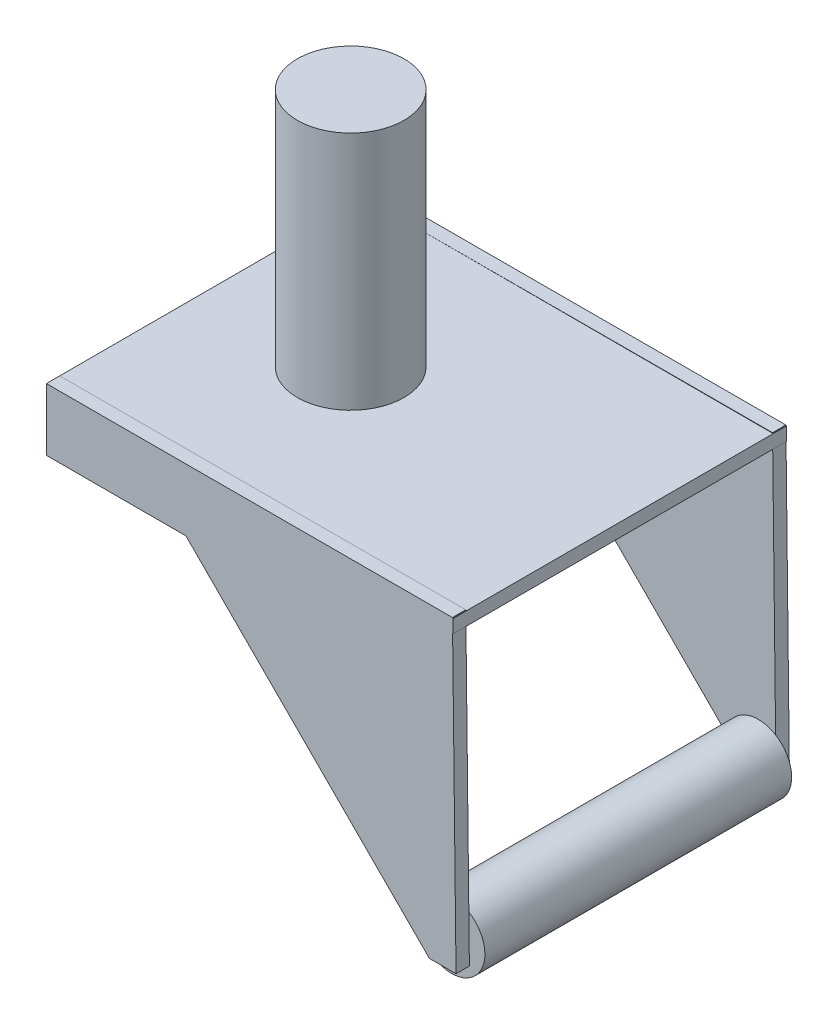
ISO-10303-21;
HEADER;
FILE_DESCRIPTION(('STEP AP214'),'2;1');
FILE_NAME('part.step','',(''),(''),'','','');
FILE_SCHEMA(('AUTOMOTIVE_DESIGN { 1 0 10303 214 1 1 1 1 }'));
ENDSEC;
DATA;
#1=APPLICATION_CONTEXT('core data for automotive mechanical design processes');
#2=APPLICATION_PROTOCOL_DEFINITION('international standard','automotive_design',2000,#1);
#3=PRODUCT_CONTEXT('',#1,'mechanical');
#4=PRODUCT('Part','Part','',(#3));
#5=PRODUCT_RELATED_PRODUCT_CATEGORY('part','',(#4));
#6=PRODUCT_DEFINITION_FORMATION('','',#4);
#7=PRODUCT_DEFINITION_CONTEXT('part definition',#1,'design');
#8=PRODUCT_DEFINITION('design','',#6,#7);
#9=PRODUCT_DEFINITION_SHAPE('','',#8);
#10=(LENGTH_UNIT() NAMED_UNIT(*) SI_UNIT(.MILLI.,.METRE.));
#11=(NAMED_UNIT(*) PLANE_ANGLE_UNIT() SI_UNIT($,.RADIAN.));
#12=(NAMED_UNIT(*) SI_UNIT($,.STERADIAN.) SOLID_ANGLE_UNIT());
#13=UNCERTAINTY_MEASURE_WITH_UNIT(LENGTH_MEASURE(1.E-05),#10,'distance_accuracy_value','');
#14=(GEOMETRIC_REPRESENTATION_CONTEXT(3) GLOBAL_UNCERTAINTY_ASSIGNED_CONTEXT((#13)) GLOBAL_UNIT_ASSIGNED_CONTEXT((#10,
#11,#12)) REPRESENTATION_CONTEXT('',''));
#15=CARTESIAN_POINT('',(0.,0.,0.));
#16=DIRECTION('',(0.,0.,1.));
#17=DIRECTION('',(1.,0.,0.));
#18=AXIS2_PLACEMENT_3D('',#15,#16,#17);
#19=CARTESIAN_POINT('',(0.,1.,0.));
#20=DIRECTION('',(0.,1.,0.));
#21=DIRECTION('',(0.,0.,1.));
#22=AXIS2_PLACEMENT_3D('',#19,#20,#21);
#23=PLANE('',#22);
#24=CARTESIAN_POINT('',(-4.93125274902113,1.,0.));
#25=DIRECTION('',(0.,1.,0.));
#26=DIRECTION('',(0.,0.,1.));
#27=AXIS2_PLACEMENT_3D('',#24,#25,#26);
#28=CIRCLE('',#27,4.);
#29=CARTESIAN_POINT('',(-4.93125274902113,1.,4.));
#30=VERTEX_POINT('',#29);
#31=EDGE_CURVE('E229',#30,#30,#28,.T.);
#32=ORIENTED_EDGE('',*,*,#31,.F.);
#33=EDGE_LOOP('',(#32));
#34=FACE_BOUND('',#33,.T.);
#35=DIRECTION('',(-1.,0.,0.));
#36=VECTOR('',#35,1.);
#37=CARTESIAN_POINT('',(-15.25,1.,-12.5));
#38=LINE('',#37,#36);
#39=CARTESIAN_POINT('',(15.25,1.,-12.5));
#40=VERTEX_POINT('',#39);
#41=CARTESIAN_POINT('',(15.2002551083508,1.,-12.5));
#42=VERTEX_POINT('',#41);
#43=EDGE_CURVE('E338',#40,#42,#38,.T.);
#44=ORIENTED_EDGE('',*,*,#43,.T.);
#45=DIRECTION('',(0.,0.,1.));
#46=VECTOR('',#45,1.);
#47=CARTESIAN_POINT('',(15.2002551083508,1.,0.));
#48=LINE('',#47,#46);
#49=CARTESIAN_POINT('',(15.2002551083508,1.,-11.5));
#50=VERTEX_POINT('',#49);
#51=EDGE_CURVE('E276',#42,#50,#48,.T.);
#52=ORIENTED_EDGE('',*,*,#51,.T.);
#53=DIRECTION('',(-1.,0.,0.));
#54=VECTOR('',#53,1.);
#55=CARTESIAN_POINT('',(0.,1.,-11.5));
#56=LINE('',#55,#54);
#57=CARTESIAN_POINT('',(-15.25,1.,-11.5));
#58=VERTEX_POINT('',#57);
#59=EDGE_CURVE('E264',#50,#58,#56,.T.);
#60=ORIENTED_EDGE('',*,*,#59,.T.);
#61=DIRECTION('',(0.,0.,1.));
#62=VECTOR('',#61,1.);
#63=CARTESIAN_POINT('',(-15.25,1.,-12.5));
#64=LINE('',#63,#62);
#65=CARTESIAN_POINT('',(-15.25,1.,11.5));
#66=VERTEX_POINT('',#65);
#67=EDGE_CURVE('E341',#58,#66,#64,.T.);
#68=ORIENTED_EDGE('',*,*,#67,.T.);
#69=DIRECTION('',(1.,0.,0.));
#70=VECTOR('',#69,1.);
#71=CARTESIAN_POINT('',(0.,1.,11.5));
#72=LINE('',#71,#70);
#73=CARTESIAN_POINT('',(15.2002551083508,1.,11.5));
#74=VERTEX_POINT('',#73);
#75=EDGE_CURVE('E318',#66,#74,#72,.T.);
#76=ORIENTED_EDGE('',*,*,#75,.T.);
#77=DIRECTION('',(0.,0.,-1.));
#78=VECTOR('',#77,1.);
#79=CARTESIAN_POINT('',(15.2002551083508,1.,0.));
#80=LINE('',#79,#78);
#81=CARTESIAN_POINT('',(15.2002551083508,1.,12.5));
#82=VERTEX_POINT('',#81);
#83=EDGE_CURVE('E331',#82,#74,#80,.T.);
#84=ORIENTED_EDGE('',*,*,#83,.F.);
#85=DIRECTION('',(1.,0.,0.));
#86=VECTOR('',#85,1.);
#87=CARTESIAN_POINT('',(-15.25,1.,12.5));
#88=LINE('',#87,#86);
#89=CARTESIAN_POINT('',(15.25,1.,12.5));
#90=VERTEX_POINT('',#89);
#91=EDGE_CURVE('E345',#82,#90,#88,.T.);
#92=ORIENTED_EDGE('',*,*,#91,.T.);
#93=DIRECTION('',(0.,0.,-1.));
#94=VECTOR('',#93,1.);
#95=CARTESIAN_POINT('',(15.25,1.,-12.5));
#96=LINE('',#95,#94);
#97=EDGE_CURVE('E335',#90,#40,#96,.T.);
#98=ORIENTED_EDGE('',*,*,#97,.T.);
#99=EDGE_LOOP('',(#44,#52,#60,#68,#76,#84,#92,#98));
#100=FACE_BOUND('',#99,.T.);
#101=ADVANCED_FACE('F43',(#34,#100),#23,.T.);
#102=CARTESIAN_POINT('',(0.,0.,0.));
#103=DIRECTION('',(0.,1.,0.));
#104=DIRECTION('',(0.,0.,1.));
#105=AXIS2_PLACEMENT_3D('',#102,#103,#104);
#106=PLANE('',#105);
#107=DIRECTION('',(0.,0.,-1.));
#108=VECTOR('',#107,1.);
#109=CARTESIAN_POINT('',(-15.2463675907073,0.,0.));
#110=LINE('',#109,#108);
#111=CARTESIAN_POINT('',(-15.2463675907073,0.,-11.5));
#112=VERTEX_POINT('',#111);
#113=CARTESIAN_POINT('',(-15.2463675907073,0.,-12.5));
#114=VERTEX_POINT('',#113);
#115=EDGE_CURVE('E11',#112,#114,#110,.T.);
#116=ORIENTED_EDGE('',*,*,#115,.F.);
#117=DIRECTION('',(-1.,0.,0.));
#118=VECTOR('',#117,1.);
#119=CARTESIAN_POINT('',(0.,0.,-11.5));
#120=LINE('',#119,#118);
#121=CARTESIAN_POINT('',(15.2118979220173,0.,-11.5));
#122=VERTEX_POINT('',#121);
#123=EDGE_CURVE('E379',#122,#112,#120,.T.);
#124=ORIENTED_EDGE('',*,*,#123,.F.);
#125=DIRECTION('',(0.,0.,1.));
#126=VECTOR('',#125,1.);
#127=CARTESIAN_POINT('',(15.2118979220173,0.,0.));
#128=LINE('',#127,#126);
#129=CARTESIAN_POINT('',(15.2118979220173,0.,-12.5));
#130=VERTEX_POINT('',#129);
#131=EDGE_CURVE('E51',#130,#122,#128,.T.);
#132=ORIENTED_EDGE('',*,*,#131,.F.);
#133=DIRECTION('',(-1.,0.,0.));
#134=VECTOR('',#133,1.);
#135=CARTESIAN_POINT('',(-15.25,0.,-12.5));
#136=LINE('',#135,#134);
#137=CARTESIAN_POINT('',(15.25,0.,-12.5));
#138=VERTEX_POINT('',#137);
#139=EDGE_CURVE('E351',#138,#130,#136,.T.);
#140=ORIENTED_EDGE('',*,*,#139,.F.);
#141=DIRECTION('',(0.,0.,-1.));
#142=VECTOR('',#141,1.);
#143=CARTESIAN_POINT('',(15.25,0.,-12.5));
#144=LINE('',#143,#142);
#145=CARTESIAN_POINT('',(15.25,0.,12.5));
#146=VERTEX_POINT('',#145);
#147=EDGE_CURVE('E334',#146,#138,#144,.T.);
#148=ORIENTED_EDGE('',*,*,#147,.F.);
#149=DIRECTION('',(1.,0.,0.));
#150=VECTOR('',#149,1.);
#151=CARTESIAN_POINT('',(-15.25,0.,12.5));
#152=LINE('',#151,#150);
#153=CARTESIAN_POINT('',(15.2118979220173,0.,12.5));
#154=VERTEX_POINT('',#153);
#155=EDGE_CURVE('E356',#154,#146,#152,.T.);
#156=ORIENTED_EDGE('',*,*,#155,.F.);
#157=DIRECTION('',(0.,0.,-1.));
#158=VECTOR('',#157,1.);
#159=CARTESIAN_POINT('',(15.2118979220173,0.,0.));
#160=LINE('',#159,#158);
#161=CARTESIAN_POINT('',(15.2118979220173,0.,11.5));
#162=VERTEX_POINT('',#161);
#163=EDGE_CURVE('E376',#154,#162,#160,.T.);
#164=ORIENTED_EDGE('',*,*,#163,.T.);
#165=DIRECTION('',(1.,0.,0.));
#166=VECTOR('',#165,1.);
#167=CARTESIAN_POINT('',(0.,0.,11.5));
#168=LINE('',#167,#166);
#169=CARTESIAN_POINT('',(-15.2463675907073,0.,11.5));
#170=VERTEX_POINT('',#169);
#171=EDGE_CURVE('E370',#170,#162,#168,.T.);
#172=ORIENTED_EDGE('',*,*,#171,.F.);
#173=DIRECTION('',(0.,0.,1.));
#174=VECTOR('',#173,1.);
#175=CARTESIAN_POINT('',(-15.2463675907073,0.,0.));
#176=LINE('',#175,#174);
#177=CARTESIAN_POINT('',(-15.2463675907073,0.,12.5));
#178=VERTEX_POINT('',#177);
#179=EDGE_CURVE('E373',#170,#178,#176,.T.);
#180=ORIENTED_EDGE('',*,*,#179,.T.);
#181=CARTESIAN_POINT('',(-15.25,0.,12.5));
#182=VERTEX_POINT('',#181);
#183=EDGE_CURVE('E339',#182,#178,#152,.T.);
#184=ORIENTED_EDGE('',*,*,#183,.F.);
#185=DIRECTION('',(0.,0.,1.));
#186=VECTOR('',#185,1.);
#187=CARTESIAN_POINT('',(-15.25,0.,-12.5));
#188=LINE('',#187,#186);
#189=CARTESIAN_POINT('',(-15.25,0.,-12.5));
#190=VERTEX_POINT('',#189);
#191=EDGE_CURVE('E354',#190,#182,#188,.T.);
#192=ORIENTED_EDGE('',*,*,#191,.F.);
#193=EDGE_CURVE('E350',#114,#190,#136,.T.);
#194=ORIENTED_EDGE('',*,*,#193,.F.);
#195=EDGE_LOOP('',(#116,#124,#132,#140,#148,#156,#164,#172,#180,#184,#192,#194));
#196=FACE_BOUND('',#195,.T.);
#197=ADVANCED_FACE('F388',(#196),#106,.F.);
#198=CARTESIAN_POINT('',(15.25,1.,-12.5));
#199=DIRECTION('',(-1.,0.,0.));
#200=DIRECTION('',(0.,0.,1.));
#201=AXIS2_PLACEMENT_3D('',#198,#199,#200);
#202=PLANE('',#201);
#203=ORIENTED_EDGE('',*,*,#147,.T.);
#204=DIRECTION('',(0.,-1.,0.));
#205=VECTOR('',#204,1.);
#206=CARTESIAN_POINT('',(15.25,1.,-12.5));
#207=LINE('',#206,#205);
#208=EDGE_CURVE('E367',#40,#138,#207,.T.);
#209=ORIENTED_EDGE('',*,*,#208,.F.);
#210=ORIENTED_EDGE('',*,*,#97,.F.);
#211=DIRECTION('',(0.,-1.,0.));
#212=VECTOR('',#211,1.);
#213=CARTESIAN_POINT('',(15.25,1.,12.5));
#214=LINE('',#213,#212);
#215=EDGE_CURVE('E347',#90,#146,#214,.T.);
#216=ORIENTED_EDGE('',*,*,#215,.T.);
#217=EDGE_LOOP('',(#203,#209,#210,#216));
#218=FACE_BOUND('',#217,.T.);
#219=ADVANCED_FACE('F45',(#218),#202,.F.);
#220=CARTESIAN_POINT('',(-15.25,1.,-12.5));
#221=DIRECTION('',(0.,0.,1.));
#222=DIRECTION('',(1.,0.,0.));
#223=AXIS2_PLACEMENT_3D('',#220,#221,#222);
#224=PLANE('',#223);
#225=DIRECTION('',(-0.0116420246251927,0.999932229334882,0.));
#226=VECTOR('',#225,1.);
#227=CARTESIAN_POINT('',(15.1998545640724,1.03440270452406,-12.5));
#228=LINE('',#227,#226);
#229=CARTESIAN_POINT('',(15.1998545640724,1.03440270452406,-12.5));
#230=VERTEX_POINT('',#229);
#231=EDGE_CURVE('E251',#42,#230,#228,.T.);
#232=ORIENTED_EDGE('',*,*,#231,.F.);
#233=ORIENTED_EDGE('',*,*,#43,.F.);
#234=ORIENTED_EDGE('',*,*,#208,.T.);
#235=ORIENTED_EDGE('',*,*,#139,.T.);
#236=CARTESIAN_POINT('',(15.4676392784001,-21.9655972954759,-12.5));
#237=VERTEX_POINT('',#236);
#238=EDGE_CURVE('E252',#237,#130,#228,.T.);
#239=ORIENTED_EDGE('',*,*,#238,.F.);
#240=DIRECTION('',(1.,0.,0.));
#241=VECTOR('',#240,1.);
#242=CARTESIAN_POINT('',(15.4676392784001,-21.9655972954759,-12.5));
#243=LINE('',#242,#241);
#244=CARTESIAN_POINT('',(13.4676392784001,-21.9655972954759,-12.5));
#245=VERTEX_POINT('',#244);
#246=EDGE_CURVE('E254',#245,#237,#243,.T.);
#247=ORIENTED_EDGE('',*,*,#246,.F.);
#248=DIRECTION('',(0.706071314809737,-0.708140733472415,0.));
#249=VECTOR('',#248,1.);
#250=CARTESIAN_POINT('',(13.4676392784001,-21.9655972954759,-12.5));
#251=LINE('',#250,#249);
#252=CARTESIAN_POINT('',(-4.78536536272791,-3.65909507179215,-12.5));
#253=VERTEX_POINT('',#252);
#254=EDGE_CURVE('E256',#253,#245,#251,.T.);
#255=ORIENTED_EDGE('',*,*,#254,.F.);
#256=DIRECTION('',(1.,0.,0.));
#257=VECTOR('',#256,1.);
#258=CARTESIAN_POINT('',(-4.78536536272791,-3.65909507179215,-12.5));
#259=LINE('',#258,#257);
#260=CARTESIAN_POINT('',(-15.2330762597655,-3.65909507179215,-12.5));
#261=VERTEX_POINT('',#260);
#262=EDGE_CURVE('E258',#261,#253,#259,.T.);
#263=ORIENTED_EDGE('',*,*,#262,.F.);
#264=DIRECTION('',(0.00363238532923815,-0.999993402866649,0.));
#265=VECTOR('',#264,1.);
#266=CARTESIAN_POINT('',(-15.2330762597655,-3.65909507179215,-12.5));
#267=LINE('',#266,#265);
#268=EDGE_CURVE('E240',#114,#261,#267,.T.);
#269=ORIENTED_EDGE('',*,*,#268,.F.);
#270=ORIENTED_EDGE('',*,*,#193,.T.);
#271=DIRECTION('',(0.,-1.,0.));
#272=VECTOR('',#271,1.);
#273=CARTESIAN_POINT('',(-15.25,1.,-12.5));
#274=LINE('',#273,#272);
#275=CARTESIAN_POINT('',(-15.25,1.,-12.5));
#276=VERTEX_POINT('',#275);
#277=EDGE_CURVE('E364',#276,#190,#274,.T.);
#278=ORIENTED_EDGE('',*,*,#277,.F.);
#279=DIRECTION('',(-0.999999361759566,-0.00112981434753581,0.));
#280=VECTOR('',#279,1.);
#281=CARTESIAN_POINT('',(-15.25,1.,-12.5));
#282=LINE('',#281,#280);
#283=EDGE_CURVE('E237',#230,#276,#282,.T.);
#284=ORIENTED_EDGE('',*,*,#283,.F.);
#285=EDGE_LOOP('',(#232,#233,#234,#235,#239,#247,#255,#263,#269,#270,#278,#284));
#286=FACE_BOUND('',#285,.T.);
#287=ADVANCED_FACE('F394',(#286),#224,.F.);
#288=CARTESIAN_POINT('',(-15.25,1.,-12.5));
#289=DIRECTION('',(1.,0.,0.));
#290=DIRECTION('',(0.,0.,-1.));
#291=AXIS2_PLACEMENT_3D('',#288,#289,#290);
#292=PLANE('',#291);
#293=ORIENTED_EDGE('',*,*,#191,.T.);
#294=DIRECTION('',(0.,-1.,0.));
#295=VECTOR('',#294,1.);
#296=CARTESIAN_POINT('',(-15.25,1.,12.5));
#297=LINE('',#296,#295);
#298=CARTESIAN_POINT('',(-15.25,1.,12.5));
#299=VERTEX_POINT('',#298);
#300=EDGE_CURVE('E361',#299,#182,#297,.T.);
#301=ORIENTED_EDGE('',*,*,#300,.F.);
#302=DIRECTION('',(0.,0.,1.));
#303=VECTOR('',#302,1.);
#304=CARTESIAN_POINT('',(-15.25,1.,11.5));
#305=LINE('',#304,#303);
#306=EDGE_CURVE('E298',#66,#299,#305,.T.);
#307=ORIENTED_EDGE('',*,*,#306,.F.);
#308=ORIENTED_EDGE('',*,*,#67,.F.);
#309=EDGE_CURVE('E342',#276,#58,#64,.T.);
#310=ORIENTED_EDGE('',*,*,#309,.F.);
#311=ORIENTED_EDGE('',*,*,#277,.T.);
#312=EDGE_LOOP('',(#293,#301,#307,#308,#310,#311));
#313=FACE_BOUND('',#312,.T.);
#314=ADVANCED_FACE('F398',(#313),#292,.F.);
#315=CARTESIAN_POINT('',(-15.25,1.,12.5));
#316=DIRECTION('',(0.,0.,-1.));
#317=DIRECTION('',(-1.,0.,0.));
#318=AXIS2_PLACEMENT_3D('',#315,#316,#317);
#319=PLANE('',#318);
#320=ORIENTED_EDGE('',*,*,#183,.T.);
#321=DIRECTION('',(0.00363238532923815,-0.999993402866649,0.));
#322=VECTOR('',#321,1.);
#323=CARTESIAN_POINT('',(-15.2330762597655,-3.65909507179215,12.5));
#324=LINE('',#323,#322);
#325=CARTESIAN_POINT('',(-15.2330762597655,-3.65909507179215,12.5));
#326=VERTEX_POINT('',#325);
#327=EDGE_CURVE('E302',#178,#326,#324,.T.);
#328=ORIENTED_EDGE('',*,*,#327,.T.);
#329=DIRECTION('',(1.,0.,0.));
#330=VECTOR('',#329,1.);
#331=CARTESIAN_POINT('',(-4.78536536272791,-3.65909507179215,12.5));
#332=LINE('',#331,#330);
#333=CARTESIAN_POINT('',(-4.78536536272791,-3.65909507179215,12.5));
#334=VERTEX_POINT('',#333);
#335=EDGE_CURVE('E304',#326,#334,#332,.T.);
#336=ORIENTED_EDGE('',*,*,#335,.T.);
#337=DIRECTION('',(0.706071314809737,-0.708140733472415,0.));
#338=VECTOR('',#337,1.);
#339=CARTESIAN_POINT('',(13.4676392784001,-21.9655972954759,12.5));
#340=LINE('',#339,#338);
#341=CARTESIAN_POINT('',(13.4676392784001,-21.9655972954759,12.5));
#342=VERTEX_POINT('',#341);
#343=EDGE_CURVE('E307',#334,#342,#340,.T.);
#344=ORIENTED_EDGE('',*,*,#343,.T.);
#345=DIRECTION('',(1.,0.,0.));
#346=VECTOR('',#345,1.);
#347=CARTESIAN_POINT('',(15.4676392784001,-21.9655972954759,12.5));
#348=LINE('',#347,#346);
#349=CARTESIAN_POINT('',(15.4676392784001,-21.9655972954759,12.5));
#350=VERTEX_POINT('',#349);
#351=EDGE_CURVE('E310',#342,#350,#348,.T.);
#352=ORIENTED_EDGE('',*,*,#351,.T.);
#353=DIRECTION('',(-0.0116420246251927,0.999932229334882,0.));
#354=VECTOR('',#353,1.);
#355=CARTESIAN_POINT('',(15.1998545640724,1.03440270452406,12.5));
#356=LINE('',#355,#354);
#357=EDGE_CURVE('E283',#350,#154,#356,.T.);
#358=ORIENTED_EDGE('',*,*,#357,.T.);
#359=ORIENTED_EDGE('',*,*,#155,.T.);
#360=ORIENTED_EDGE('',*,*,#215,.F.);
#361=ORIENTED_EDGE('',*,*,#91,.F.);
#362=CARTESIAN_POINT('',(15.1998545640724,1.03440270452406,12.5));
#363=VERTEX_POINT('',#362);
#364=EDGE_CURVE('E313',#82,#363,#356,.T.);
#365=ORIENTED_EDGE('',*,*,#364,.T.);
#366=DIRECTION('',(-0.999999361759566,-0.00112981434753581,0.));
#367=VECTOR('',#366,1.);
#368=CARTESIAN_POINT('',(-15.25,1.,12.5));
#369=LINE('',#368,#367);
#370=EDGE_CURVE('E278',#363,#299,#369,.T.);
#371=ORIENTED_EDGE('',*,*,#370,.T.);
#372=ORIENTED_EDGE('',*,*,#300,.T.);
#373=EDGE_LOOP('',(#320,#328,#336,#344,#352,#358,#359,#360,#361,#365,#371,#372));
#374=FACE_BOUND('',#373,.T.);
#375=ADVANCED_FACE('F437',(#374),#319,.F.);
#376=CARTESIAN_POINT('',(-4.78536536272791,-3.65909507179215,11.5));
#377=DIRECTION('',(0.,-1.,0.));
#378=DIRECTION('',(0.,0.,-1.));
#379=AXIS2_PLACEMENT_3D('',#376,#377,#378);
#380=PLANE('',#379);
#381=ORIENTED_EDGE('',*,*,#335,.F.);
#382=DIRECTION('',(0.,0.,1.));
#383=VECTOR('',#382,1.);
#384=CARTESIAN_POINT('',(-15.2330762597655,-3.65909507179215,11.5));
#385=LINE('',#384,#383);
#386=CARTESIAN_POINT('',(-15.2330762597655,-3.65909507179215,11.5));
#387=VERTEX_POINT('',#386);
#388=EDGE_CURVE('E325',#387,#326,#385,.T.);
#389=ORIENTED_EDGE('',*,*,#388,.F.);
#390=DIRECTION('',(1.,0.,0.));
#391=VECTOR('',#390,1.);
#392=CARTESIAN_POINT('',(-4.78536536272791,-3.65909507179215,11.5));
#393=LINE('',#392,#391);
#394=CARTESIAN_POINT('',(-4.78536536272791,-3.65909507179215,11.5));
#395=VERTEX_POINT('',#394);
#396=EDGE_CURVE('E285',#387,#395,#393,.T.);
#397=ORIENTED_EDGE('',*,*,#396,.T.);
#398=DIRECTION('',(0.,0.,1.));
#399=VECTOR('',#398,1.);
#400=CARTESIAN_POINT('',(-4.78536536272791,-3.65909507179215,11.5));
#401=LINE('',#400,#399);
#402=EDGE_CURVE('E323',#395,#334,#401,.T.);
#403=ORIENTED_EDGE('',*,*,#402,.T.);
#404=EDGE_LOOP('',(#381,#389,#397,#403));
#405=FACE_BOUND('',#404,.T.);
#406=ADVANCED_FACE('F440',(#405),#380,.T.);
#407=CARTESIAN_POINT('',(13.4676392784001,-21.9655972954759,11.5));
#408=DIRECTION('',(-0.708140733472415,-0.706071314809737,0.));
#409=DIRECTION('',(0.706071314809737,-0.708140733472415,0.));
#410=AXIS2_PLACEMENT_3D('',#407,#408,#409);
#411=PLANE('',#410);
#412=ORIENTED_EDGE('',*,*,#343,.F.);
#413=ORIENTED_EDGE('',*,*,#402,.F.);
#414=DIRECTION('',(0.706071314809737,-0.708140733472415,0.));
#415=VECTOR('',#414,1.);
#416=CARTESIAN_POINT('',(13.4676392784001,-21.9655972954759,11.5));
#417=LINE('',#416,#415);
#418=CARTESIAN_POINT('',(11.6730562131346,-20.1657545013288,11.5));
#419=VERTEX_POINT('',#418);
#420=EDGE_CURVE('E288',#395,#419,#417,.T.);
#421=ORIENTED_EDGE('',*,*,#420,.T.);
#422=DIRECTION('',(-0.706071314809737,0.708140733472415,0.));
#423=VECTOR('',#422,1.);
#424=CARTESIAN_POINT('',(13.4676392784001,-21.9655972954759,11.5));
#425=LINE('',#424,#423);
#426=CARTESIAN_POINT('',(13.4676392784001,-21.9655972954759,11.5));
#427=VERTEX_POINT('',#426);
#428=EDGE_CURVE('E235',#427,#419,#425,.T.);
#429=ORIENTED_EDGE('',*,*,#428,.F.);
#430=DIRECTION('',(0.,0.,1.));
#431=VECTOR('',#430,1.);
#432=CARTESIAN_POINT('',(13.4676392784001,-21.9655972954759,11.5));
#433=LINE('',#432,#431);
#434=EDGE_CURVE('E321',#427,#342,#433,.T.);
#435=ORIENTED_EDGE('',*,*,#434,.T.);
#436=EDGE_LOOP('',(#412,#413,#421,#429,#435));
#437=FACE_BOUND('',#436,.T.);
#438=ADVANCED_FACE('F487',(#437),#411,.T.);
#439=CARTESIAN_POINT('',(15.4676392784001,-21.9655972954759,11.5));
#440=DIRECTION('',(0.,-1.,0.));
#441=DIRECTION('',(0.,0.,-1.));
#442=AXIS2_PLACEMENT_3D('',#439,#440,#441);
#443=PLANE('',#442);
#444=ORIENTED_EDGE('',*,*,#351,.F.);
#445=ORIENTED_EDGE('',*,*,#434,.F.);
#446=DIRECTION('',(1.,0.,0.));
#447=VECTOR('',#446,1.);
#448=CARTESIAN_POINT('',(15.4676392784001,-21.9655972954759,11.5));
#449=LINE('',#448,#447);
#450=CARTESIAN_POINT('',(15.4676392784001,-21.9655972954759,11.5));
#451=VERTEX_POINT('',#450);
#452=EDGE_CURVE('E291',#427,#451,#449,.T.);
#453=ORIENTED_EDGE('',*,*,#452,.T.);
#454=DIRECTION('',(0.,0.,1.));
#455=VECTOR('',#454,1.);
#456=CARTESIAN_POINT('',(15.4676392784001,-21.9655972954759,11.5));
#457=LINE('',#456,#455);
#458=EDGE_CURVE('E319',#451,#350,#457,.T.);
#459=ORIENTED_EDGE('',*,*,#458,.T.);
#460=EDGE_LOOP('',(#444,#445,#453,#459));
#461=FACE_BOUND('',#460,.T.);
#462=ADVANCED_FACE('F484',(#461),#443,.T.);
#463=CARTESIAN_POINT('',(0.,0.,11.5));
#464=DIRECTION('',(0.,0.,1.));
#465=DIRECTION('',(1.,0.,0.));
#466=AXIS2_PLACEMENT_3D('',#463,#464,#465);
#467=PLANE('',#466);
#468=CARTESIAN_POINT('',(14.132711902623,-20.6130730557921,11.5));
#469=DIRECTION('',(0.,0.,1.));
#470=DIRECTION('',(1.,0.,0.));
#471=AXIS2_PLACEMENT_3D('',#468,#469,#470);
#472=CIRCLE('',#471,2.5);
#473=CARTESIAN_POINT('',(15.4269894057322,-18.4741841514903,11.5));
#474=VERTEX_POINT('',#473);
#475=EDGE_CURVE('E57',#474,#419,#472,.T.);
#476=ORIENTED_EDGE('',*,*,#475,.T.);
#477=ORIENTED_EDGE('',*,*,#420,.F.);
#478=ORIENTED_EDGE('',*,*,#396,.F.);
#479=DIRECTION('',(0.00363238532923815,-0.999993402866649,0.));
#480=VECTOR('',#479,1.);
#481=CARTESIAN_POINT('',(-15.2330762597655,-3.65909507179215,11.5));
#482=LINE('',#481,#480);
#483=EDGE_CURVE('E282',#170,#387,#482,.T.);
#484=ORIENTED_EDGE('',*,*,#483,.F.);
#485=ORIENTED_EDGE('',*,*,#171,.T.);
#486=DIRECTION('',(-0.0116420246251927,0.999932229334882,0.));
#487=VECTOR('',#486,1.);
#488=CARTESIAN_POINT('',(15.1998545640724,1.03440270452406,11.5));
#489=LINE('',#488,#487);
#490=EDGE_CURVE('E299',#474,#162,#489,.T.);
#491=ORIENTED_EDGE('',*,*,#490,.F.);
#492=EDGE_LOOP('',(#476,#477,#478,#484,#485,#491));
#493=FACE_BOUND('',#492,.T.);
#494=ADVANCED_FACE('F479',(#493),#467,.F.);
#495=CARTESIAN_POINT('',(-15.2330762597655,-3.65909507179215,11.5));
#496=DIRECTION('',(-0.999993402866649,-0.00363238532923815,0.));
#497=DIRECTION('',(0.00363238532923815,-0.999993402866649,0.));
#498=AXIS2_PLACEMENT_3D('',#495,#496,#497);
#499=PLANE('',#498);
#500=ORIENTED_EDGE('',*,*,#179,.F.);
#501=ORIENTED_EDGE('',*,*,#483,.T.);
#502=ORIENTED_EDGE('',*,*,#388,.T.);
#503=ORIENTED_EDGE('',*,*,#327,.F.);
#504=EDGE_LOOP('',(#500,#501,#502,#503));
#505=FACE_BOUND('',#504,.T.);
#506=ADVANCED_FACE('F494',(#505),#499,.T.);
#507=CARTESIAN_POINT('',(15.1998545640724,1.03440270452406,11.5));
#508=DIRECTION('',(0.999932229334882,0.0116420246251927,0.));
#509=DIRECTION('',(-0.0116420246251927,0.999932229334882,0.));
#510=AXIS2_PLACEMENT_3D('',#507,#508,#509);
#511=PLANE('',#510);
#512=ORIENTED_EDGE('',*,*,#163,.F.);
#513=ORIENTED_EDGE('',*,*,#357,.F.);
#514=ORIENTED_EDGE('',*,*,#458,.F.);
#515=EDGE_CURVE('E295',#451,#474,#489,.T.);
#516=ORIENTED_EDGE('',*,*,#515,.T.);
#517=ORIENTED_EDGE('',*,*,#490,.T.);
#518=EDGE_LOOP('',(#512,#513,#514,#516,#517));
#519=FACE_BOUND('',#518,.T.);
#520=ADVANCED_FACE('F483',(#519),#511,.T.);
#521=CARTESIAN_POINT('',(-15.25,1.,11.5));
#522=DIRECTION('',(-0.00112981434753581,0.999999361759566,0.));
#523=DIRECTION('',(-0.999999361759566,-0.00112981434753581,0.));
#524=AXIS2_PLACEMENT_3D('',#521,#522,#523);
#525=PLANE('',#524);
#526=ORIENTED_EDGE('',*,*,#370,.F.);
#527=DIRECTION('',(0.,0.,1.));
#528=VECTOR('',#527,1.);
#529=CARTESIAN_POINT('',(15.1998545640724,1.03440270452406,11.5));
#530=LINE('',#529,#528);
#531=CARTESIAN_POINT('',(15.1998545640724,1.03440270452406,11.5));
#532=VERTEX_POINT('',#531);
#533=EDGE_CURVE('E315',#532,#363,#530,.T.);
#534=ORIENTED_EDGE('',*,*,#533,.F.);
#535=DIRECTION('',(-0.999999361759566,-0.00112981434753581,0.));
#536=VECTOR('',#535,1.);
#537=CARTESIAN_POINT('',(-15.25,1.,11.5));
#538=LINE('',#537,#536);
#539=EDGE_CURVE('E279',#532,#66,#538,.T.);
#540=ORIENTED_EDGE('',*,*,#539,.T.);
#541=ORIENTED_EDGE('',*,*,#306,.T.);
#542=EDGE_LOOP('',(#526,#534,#540,#541));
#543=FACE_BOUND('',#542,.T.);
#544=ADVANCED_FACE('F434',(#543),#525,.T.);
#545=ORIENTED_EDGE('',*,*,#364,.F.);
#546=ORIENTED_EDGE('',*,*,#83,.T.);
#547=EDGE_CURVE('E294',#74,#532,#489,.T.);
#548=ORIENTED_EDGE('',*,*,#547,.T.);
#549=ORIENTED_EDGE('',*,*,#533,.T.);
#550=EDGE_LOOP('',(#545,#546,#548,#549));
#551=FACE_BOUND('',#550,.T.);
#552=ADVANCED_FACE('F477',(#551),#511,.T.);
#553=ORIENTED_EDGE('',*,*,#75,.F.);
#554=ORIENTED_EDGE('',*,*,#539,.F.);
#555=ORIENTED_EDGE('',*,*,#547,.F.);
#556=EDGE_LOOP('',(#553,#554,#555));
#557=FACE_BOUND('',#556,.T.);
#558=ADVANCED_FACE('F471',(#557),#467,.F.);
#559=CARTESIAN_POINT('',(15.4676392784001,-21.9655972954759,-11.5));
#560=DIRECTION('',(0.,1.,0.));
#561=DIRECTION('',(0.,0.,1.));
#562=AXIS2_PLACEMENT_3D('',#559,#560,#561);
#563=PLANE('',#562);
#564=ORIENTED_EDGE('',*,*,#246,.T.);
#565=DIRECTION('',(0.,0.,-1.));
#566=VECTOR('',#565,1.);
#567=CARTESIAN_POINT('',(15.4676392784001,-21.9655972954759,-11.5));
#568=LINE('',#567,#566);
#569=CARTESIAN_POINT('',(15.4676392784001,-21.9655972954759,-11.5));
#570=VERTEX_POINT('',#569);
#571=EDGE_CURVE('E271',#570,#237,#568,.T.);
#572=ORIENTED_EDGE('',*,*,#571,.F.);
#573=DIRECTION('',(1.,0.,0.));
#574=VECTOR('',#573,1.);
#575=CARTESIAN_POINT('',(15.4676392784001,-21.9655972954759,-11.5));
#576=LINE('',#575,#574);
#577=CARTESIAN_POINT('',(13.4676392784001,-21.9655972954759,-11.5));
#578=VERTEX_POINT('',#577);
#579=EDGE_CURVE('E225',#578,#570,#576,.T.);
#580=ORIENTED_EDGE('',*,*,#579,.F.);
#581=DIRECTION('',(0.,0.,-1.));
#582=VECTOR('',#581,1.);
#583=CARTESIAN_POINT('',(13.4676392784001,-21.9655972954759,-11.5));
#584=LINE('',#583,#582);
#585=EDGE_CURVE('E268',#578,#245,#584,.T.);
#586=ORIENTED_EDGE('',*,*,#585,.T.);
#587=EDGE_LOOP('',(#564,#572,#580,#586));
#588=FACE_BOUND('',#587,.T.);
#589=ADVANCED_FACE('F459',(#588),#563,.F.);
#590=CARTESIAN_POINT('',(13.4676392784001,-21.9655972954759,-11.5));
#591=DIRECTION('',(0.708140733472415,0.706071314809737,0.));
#592=DIRECTION('',(-0.706071314809737,0.708140733472415,0.));
#593=AXIS2_PLACEMENT_3D('',#590,#591,#592);
#594=PLANE('',#593);
#595=ORIENTED_EDGE('',*,*,#254,.T.);
#596=ORIENTED_EDGE('',*,*,#585,.F.);
#597=DIRECTION('',(0.706071314809737,-0.708140733472415,0.));
#598=VECTOR('',#597,1.);
#599=CARTESIAN_POINT('',(13.4676392784001,-21.9655972954759,-11.5));
#600=LINE('',#599,#598);
#601=CARTESIAN_POINT('',(11.6730562131346,-20.1657545013288,-11.5));
#602=VERTEX_POINT('',#601);
#603=EDGE_CURVE('E65',#602,#578,#600,.T.);
#604=ORIENTED_EDGE('',*,*,#603,.F.);
#605=DIRECTION('',(0.706071314809737,-0.708140733472415,0.));
#606=VECTOR('',#605,1.);
#607=CARTESIAN_POINT('',(13.4676392784001,-21.9655972954759,-11.5));
#608=LINE('',#607,#606);
#609=CARTESIAN_POINT('',(-4.78536536272791,-3.65909507179215,-11.5));
#610=VERTEX_POINT('',#609);
#611=EDGE_CURVE('E215',#610,#602,#608,.T.);
#612=ORIENTED_EDGE('',*,*,#611,.F.);
#613=DIRECTION('',(0.,0.,-1.));
#614=VECTOR('',#613,1.);
#615=CARTESIAN_POINT('',(-4.78536536272791,-3.65909507179215,-11.5));
#616=LINE('',#615,#614);
#617=EDGE_CURVE('E265',#610,#253,#616,.T.);
#618=ORIENTED_EDGE('',*,*,#617,.T.);
#619=EDGE_LOOP('',(#595,#596,#604,#612,#618));
#620=FACE_BOUND('',#619,.T.);
#621=ADVANCED_FACE('F460',(#620),#594,.F.);
#622=CARTESIAN_POINT('',(-4.78536536272791,-3.65909507179215,-11.5));
#623=DIRECTION('',(0.,1.,0.));
#624=DIRECTION('',(0.,0.,1.));
#625=AXIS2_PLACEMENT_3D('',#622,#623,#624);
#626=PLANE('',#625);
#627=ORIENTED_EDGE('',*,*,#262,.T.);
#628=ORIENTED_EDGE('',*,*,#617,.F.);
#629=DIRECTION('',(1.,0.,0.));
#630=VECTOR('',#629,1.);
#631=CARTESIAN_POINT('',(-4.78536536272791,-3.65909507179215,-11.5));
#632=LINE('',#631,#630);
#633=CARTESIAN_POINT('',(-15.2330762597655,-3.65909507179215,-11.5));
#634=VERTEX_POINT('',#633);
#635=EDGE_CURVE('E244',#634,#610,#632,.T.);
#636=ORIENTED_EDGE('',*,*,#635,.F.);
#637=DIRECTION('',(0.,0.,-1.));
#638=VECTOR('',#637,1.);
#639=CARTESIAN_POINT('',(-15.2330762597655,-3.65909507179215,-11.5));
#640=LINE('',#639,#638);
#641=EDGE_CURVE('E261',#634,#261,#640,.T.);
#642=ORIENTED_EDGE('',*,*,#641,.T.);
#643=EDGE_LOOP('',(#627,#628,#636,#642));
#644=FACE_BOUND('',#643,.T.);
#645=ADVANCED_FACE('F424',(#644),#626,.F.);
#646=CARTESIAN_POINT('',(0.,0.,-11.5));
#647=DIRECTION('',(0.,0.,-1.));
#648=DIRECTION('',(1.,0.,0.));
#649=AXIS2_PLACEMENT_3D('',#646,#647,#648);
#650=PLANE('',#649);
#651=CARTESIAN_POINT('',(14.132711902623,-20.6130730557921,-11.5));
#652=DIRECTION('',(0.,0.,1.));
#653=DIRECTION('',(1.,0.,0.));
#654=AXIS2_PLACEMENT_3D('',#651,#652,#653);
#655=CIRCLE('',#654,2.5);
#656=CARTESIAN_POINT('',(15.4269894057322,-18.4741841514903,-11.5));
#657=VERTEX_POINT('',#656);
#658=EDGE_CURVE('E213',#657,#602,#655,.T.);
#659=ORIENTED_EDGE('',*,*,#658,.F.);
#660=DIRECTION('',(-0.0116420246251927,0.999932229334882,0.));
#661=VECTOR('',#660,1.);
#662=CARTESIAN_POINT('',(15.1998545640724,1.03440270452406,-11.5));
#663=LINE('',#662,#661);
#664=EDGE_CURVE('E200',#657,#122,#663,.T.);
#665=ORIENTED_EDGE('',*,*,#664,.T.);
#666=ORIENTED_EDGE('',*,*,#123,.T.);
#667=DIRECTION('',(0.00363238532923815,-0.999993402866649,0.));
#668=VECTOR('',#667,1.);
#669=CARTESIAN_POINT('',(-15.2330762597655,-3.65909507179215,-11.5));
#670=LINE('',#669,#668);
#671=EDGE_CURVE('E246',#112,#634,#670,.T.);
#672=ORIENTED_EDGE('',*,*,#671,.T.);
#673=ORIENTED_EDGE('',*,*,#635,.T.);
#674=ORIENTED_EDGE('',*,*,#611,.T.);
#675=EDGE_LOOP('',(#659,#665,#666,#672,#673,#674));
#676=FACE_BOUND('',#675,.T.);
#677=ADVANCED_FACE('F214',(#676),#650,.F.);
#678=CARTESIAN_POINT('',(15.1998545640724,1.03440270452406,-11.5));
#679=DIRECTION('',(-0.999932229334882,-0.0116420246251927,0.));
#680=DIRECTION('',(0.0116420246251927,-0.999932229334882,0.));
#681=AXIS2_PLACEMENT_3D('',#678,#679,#680);
#682=PLANE('',#681);
#683=ORIENTED_EDGE('',*,*,#238,.T.);
#684=ORIENTED_EDGE('',*,*,#131,.T.);
#685=ORIENTED_EDGE('',*,*,#664,.F.);
#686=EDGE_CURVE('E205',#570,#657,#663,.T.);
#687=ORIENTED_EDGE('',*,*,#686,.F.);
#688=ORIENTED_EDGE('',*,*,#571,.T.);
#689=EDGE_LOOP('',(#683,#684,#685,#687,#688));
#690=FACE_BOUND('',#689,.T.);
#691=ADVANCED_FACE('F202',(#690),#682,.F.);
#692=CARTESIAN_POINT('',(-15.2330762597655,-3.65909507179215,-11.5));
#693=DIRECTION('',(0.999993402866649,0.00363238532923815,0.));
#694=DIRECTION('',(-0.00363238532923815,0.999993402866649,0.));
#695=AXIS2_PLACEMENT_3D('',#692,#693,#694);
#696=PLANE('',#695);
#697=ORIENTED_EDGE('',*,*,#671,.F.);
#698=ORIENTED_EDGE('',*,*,#115,.T.);
#699=ORIENTED_EDGE('',*,*,#268,.T.);
#700=ORIENTED_EDGE('',*,*,#641,.F.);
#701=EDGE_LOOP('',(#697,#698,#699,#700));
#702=FACE_BOUND('',#701,.T.);
#703=ADVANCED_FACE('F385',(#702),#696,.F.);
#704=CARTESIAN_POINT('',(-15.25,1.,-11.5));
#705=DIRECTION('',(0.00112981434753581,-0.999999361759566,0.));
#706=DIRECTION('',(0.999999361759566,0.00112981434753581,0.));
#707=AXIS2_PLACEMENT_3D('',#704,#705,#706);
#708=PLANE('',#707);
#709=ORIENTED_EDGE('',*,*,#283,.T.);
#710=ORIENTED_EDGE('',*,*,#309,.T.);
#711=DIRECTION('',(-0.999999361759566,-0.00112981434753581,0.));
#712=VECTOR('',#711,1.);
#713=CARTESIAN_POINT('',(-15.25,1.,-11.5));
#714=LINE('',#713,#712);
#715=CARTESIAN_POINT('',(15.1998545640724,1.03440270452406,-11.5));
#716=VERTEX_POINT('',#715);
#717=EDGE_CURVE('E238',#716,#58,#714,.T.);
#718=ORIENTED_EDGE('',*,*,#717,.F.);
#719=DIRECTION('',(0.,0.,-1.));
#720=VECTOR('',#719,1.);
#721=CARTESIAN_POINT('',(15.1998545640724,1.03440270452406,-11.5));
#722=LINE('',#721,#720);
#723=EDGE_CURVE('E248',#716,#230,#722,.T.);
#724=ORIENTED_EDGE('',*,*,#723,.T.);
#725=EDGE_LOOP('',(#709,#710,#718,#724));
#726=FACE_BOUND('',#725,.T.);
#727=ADVANCED_FACE('F403',(#726),#708,.F.);
#728=ORIENTED_EDGE('',*,*,#51,.F.);
#729=ORIENTED_EDGE('',*,*,#231,.T.);
#730=ORIENTED_EDGE('',*,*,#723,.F.);
#731=EDGE_CURVE('E210',#50,#716,#663,.T.);
#732=ORIENTED_EDGE('',*,*,#731,.F.);
#733=EDGE_LOOP('',(#728,#729,#730,#732));
#734=FACE_BOUND('',#733,.T.);
#735=ADVANCED_FACE('F407',(#734),#682,.F.);
#736=ORIENTED_EDGE('',*,*,#59,.F.);
#737=ORIENTED_EDGE('',*,*,#731,.T.);
#738=ORIENTED_EDGE('',*,*,#717,.T.);
#739=EDGE_LOOP('',(#736,#737,#738));
#740=FACE_BOUND('',#739,.T.);
#741=ADVANCED_FACE('F412',(#740),#650,.F.);
#742=CARTESIAN_POINT('',(14.132711902623,-20.6130730557921,-11.5));
#743=DIRECTION('',(0.,0.,1.));
#744=DIRECTION('',(1.,0.,0.));
#745=AXIS2_PLACEMENT_3D('',#742,#743,#744);
#746=PLANE('',#745);
#747=EDGE_CURVE('E220',#602,#657,#655,.T.);
#748=ORIENTED_EDGE('',*,*,#747,.F.);
#749=ORIENTED_EDGE('',*,*,#603,.T.);
#750=ORIENTED_EDGE('',*,*,#579,.T.);
#751=ORIENTED_EDGE('',*,*,#686,.T.);
#752=EDGE_LOOP('',(#748,#749,#750,#751));
#753=FACE_BOUND('',#752,.T.);
#754=ADVANCED_FACE('F223',(#753),#746,.F.);
#755=CARTESIAN_POINT('',(14.132711902623,-20.6130730557921,11.5));
#756=DIRECTION('',(0.,0.,-1.));
#757=DIRECTION('',(-1.,0.,0.));
#758=AXIS2_PLACEMENT_3D('',#755,#756,#757);
#759=CYLINDRICAL_SURFACE('',#758,2.5);
#760=ORIENTED_EDGE('',*,*,#475,.F.);
#761=EDGE_CURVE('E219',#419,#474,#472,.T.);
#762=ORIENTED_EDGE('',*,*,#761,.F.);
#763=EDGE_LOOP('',(#760,#762));
#764=FACE_BOUND('',#763,.T.);
#765=ORIENTED_EDGE('',*,*,#658,.T.);
#766=ORIENTED_EDGE('',*,*,#747,.T.);
#767=EDGE_LOOP('',(#765,#766));
#768=FACE_BOUND('',#767,.T.);
#769=ADVANCED_FACE('F226',(#764,#768),#759,.T.);
#770=CARTESIAN_POINT('',(14.132711902623,-20.6130730557921,11.5));
#771=DIRECTION('',(0.,0.,1.));
#772=DIRECTION('',(1.,0.,0.));
#773=AXIS2_PLACEMENT_3D('',#770,#771,#772);
#774=PLANE('',#773);
#775=ORIENTED_EDGE('',*,*,#452,.F.);
#776=ORIENTED_EDGE('',*,*,#428,.T.);
#777=ORIENTED_EDGE('',*,*,#761,.T.);
#778=ORIENTED_EDGE('',*,*,#515,.F.);
#779=EDGE_LOOP('',(#775,#776,#777,#778));
#780=FACE_BOUND('',#779,.T.);
#781=ADVANCED_FACE('F525',(#780),#774,.T.);
#782=CARTESIAN_POINT('',(-4.93125274902113,19.,0.));
#783=DIRECTION('',(0.,-1.,0.));
#784=DIRECTION('',(0.,0.,-1.));
#785=AXIS2_PLACEMENT_3D('',#782,#783,#784);
#786=CYLINDRICAL_SURFACE('',#785,4.);
#787=CARTESIAN_POINT('',(-4.93125274902113,19.,0.));
#788=DIRECTION('',(0.,1.,0.));
#789=DIRECTION('',(0.,0.,1.));
#790=AXIS2_PLACEMENT_3D('',#787,#788,#789);
#791=CIRCLE('',#790,4.);
#792=CARTESIAN_POINT('',(-4.93125274902113,19.,4.));
#793=VERTEX_POINT('',#792);
#794=EDGE_CURVE('E227',#793,#793,#791,.T.);
#795=ORIENTED_EDGE('',*,*,#794,.F.);
#796=EDGE_LOOP('',(#795));
#797=FACE_BOUND('',#796,.T.);
#798=ORIENTED_EDGE('',*,*,#31,.T.);
#799=EDGE_LOOP('',(#798));
#800=FACE_BOUND('',#799,.T.);
#801=ADVANCED_FACE('F531',(#797,#800),#786,.T.);
#802=CARTESIAN_POINT('',(-4.93125274902113,19.,0.));
#803=DIRECTION('',(0.,1.,0.));
#804=DIRECTION('',(0.,0.,1.));
#805=AXIS2_PLACEMENT_3D('',#802,#803,#804);
#806=PLANE('',#805);
#807=ORIENTED_EDGE('',*,*,#794,.T.);
#808=EDGE_LOOP('',(#807));
#809=FACE_BOUND('',#808,.T.);
#810=ADVANCED_FACE('F536',(#809),#806,.T.);
#811=CLOSED_SHELL('',(#101,#197,#219,#287,#314,#375,#406,#438,#462,#494,#506,#520,#544,#552,
#558,#589,#621,#645,#677,#691,#703,#727,#735,#741,#754,#769,#781,#801,#810));
#812=MANIFOLD_SOLID_BREP('B2',#811);
#813=ADVANCED_BREP_SHAPE_REPRESENTATION('',(#18,#812),#14);
#814=SHAPE_DEFINITION_REPRESENTATION(#9,#813);
ENDSEC;
END-ISO-10303-21;
